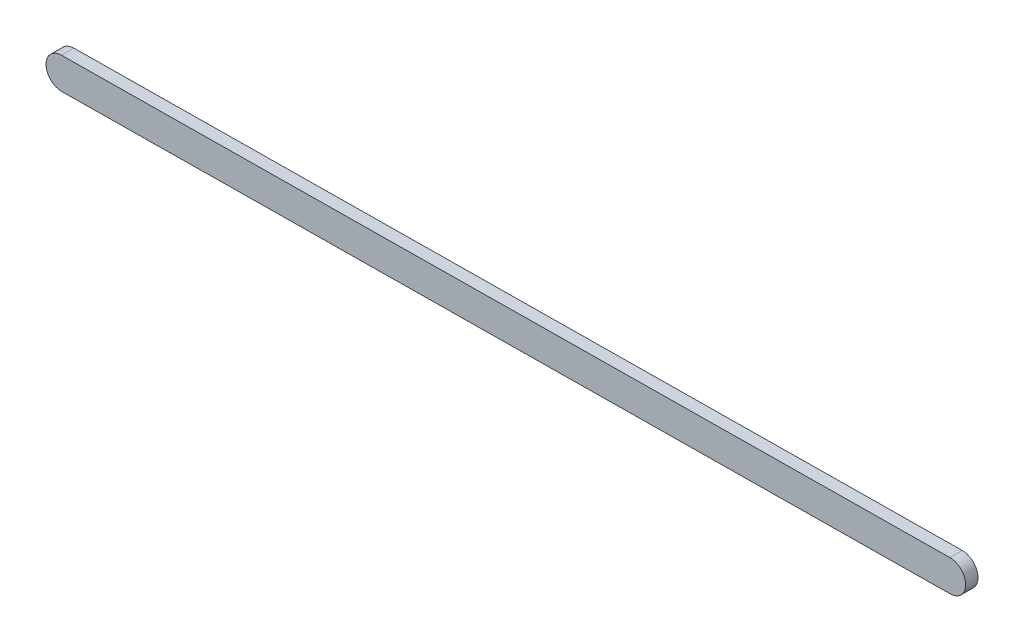
ISO-10303-21;
HEADER;
FILE_DESCRIPTION(('STEP AP214'),'2;1');
FILE_NAME('part.step','',(''),(''),'','','');
FILE_SCHEMA(('AUTOMOTIVE_DESIGN { 1 0 10303 214 1 1 1 1 }'));
ENDSEC;
DATA;
#1=APPLICATION_CONTEXT('core data for automotive mechanical design processes');
#2=APPLICATION_PROTOCOL_DEFINITION('international standard','automotive_design',2000,#1);
#3=PRODUCT_CONTEXT('',#1,'mechanical');
#4=PRODUCT('Part','Part','',(#3));
#5=PRODUCT_RELATED_PRODUCT_CATEGORY('part','',(#4));
#6=PRODUCT_DEFINITION_FORMATION('','',#4);
#7=PRODUCT_DEFINITION_CONTEXT('part definition',#1,'design');
#8=PRODUCT_DEFINITION('design','',#6,#7);
#9=PRODUCT_DEFINITION_SHAPE('','',#8);
#10=(LENGTH_UNIT() NAMED_UNIT(*) SI_UNIT(.MILLI.,.METRE.));
#11=(NAMED_UNIT(*) PLANE_ANGLE_UNIT() SI_UNIT($,.RADIAN.));
#12=(NAMED_UNIT(*) SI_UNIT($,.STERADIAN.) SOLID_ANGLE_UNIT());
#13=UNCERTAINTY_MEASURE_WITH_UNIT(LENGTH_MEASURE(1.E-05),#10,'distance_accuracy_value','');
#14=(GEOMETRIC_REPRESENTATION_CONTEXT(3) GLOBAL_UNCERTAINTY_ASSIGNED_CONTEXT((#13)) GLOBAL_UNIT_ASSIGNED_CONTEXT((#10,
#11,#12)) REPRESENTATION_CONTEXT('',''));
#15=CARTESIAN_POINT('',(0.,0.,0.));
#16=DIRECTION('',(0.,0.,1.));
#17=DIRECTION('',(1.,0.,0.));
#18=AXIS2_PLACEMENT_3D('',#15,#16,#17);
#19=CARTESIAN_POINT('',(94.83165438,53.00981524,0.));
#20=DIRECTION('',(-0.010322812390654,0.999946718352707,0.));
#21=DIRECTION('',(0.999946718352707,0.010322812390654,0.));
#22=AXIS2_PLACEMENT_3D('',#19,#20,#21);
#23=PLANE('',#22);
#24=DIRECTION('',(0.999946718352707,0.010322812390654,0.));
#25=VECTOR('',#24,1.);
#26=CARTESIAN_POINT('',(94.83165438,53.00981524,0.1999996));
#27=LINE('',#26,#25);
#28=CARTESIAN_POINT('',(94.83165438,53.00981524,0.1999996));
#29=VERTEX_POINT('',#28);
#30=CARTESIAN_POINT('',(109.24441194,53.15860336,0.1999996));
#31=VERTEX_POINT('',#30);
#32=EDGE_CURVE('E11',#29,#31,#27,.T.);
#33=ORIENTED_EDGE('',*,*,#32,.F.);
#34=DIRECTION('',(0.,0.,1.));
#35=VECTOR('',#34,1.);
#36=CARTESIAN_POINT('',(94.83165438,53.00981524,0.));
#37=LINE('',#36,#35);
#38=CARTESIAN_POINT('',(94.83165438,53.00981524,0.));
#39=VERTEX_POINT('',#38);
#40=EDGE_CURVE('E24',#39,#29,#37,.T.);
#41=ORIENTED_EDGE('',*,*,#40,.F.);
#42=DIRECTION('',(0.999946718352707,0.010322812390654,0.));
#43=VECTOR('',#42,1.);
#44=CARTESIAN_POINT('',(94.83165438,53.00981524,0.));
#45=LINE('',#44,#43);
#46=CARTESIAN_POINT('',(109.24441194,53.15860336,0.));
#47=VERTEX_POINT('',#46);
#48=EDGE_CURVE('E75',#39,#47,#45,.T.);
#49=ORIENTED_EDGE('',*,*,#48,.T.);
#50=DIRECTION('',(0.,0.,1.));
#51=VECTOR('',#50,1.);
#52=CARTESIAN_POINT('',(109.24441194,53.15860336,0.));
#53=LINE('',#52,#51);
#54=EDGE_CURVE('E37',#47,#31,#53,.T.);
#55=ORIENTED_EDGE('',*,*,#54,.T.);
#56=EDGE_LOOP('',(#33,#41,#49,#55));
#57=FACE_BOUND('',#56,.T.);
#58=ADVANCED_FACE('F17',(#57),#23,.F.);
#59=CARTESIAN_POINT('',(109.241788120258,53.4125906337885,0.));
#60=DIRECTION('',(0.,0.,-1.));
#61=DIRECTION('',(0.0103299653868157,-0.999946644484148,0.));
#62=AXIS2_PLACEMENT_3D('',#59,#60,#61);
#63=CYLINDRICAL_SURFACE('',#62,0.254000826133655);
#64=CARTESIAN_POINT('',(109.241788120258,53.4125906337885,0.1999996));
#65=DIRECTION('',(0.,0.,1.));
#66=DIRECTION('',(0.0103299653868157,-0.999946644484148,0.));
#67=AXIS2_PLACEMENT_3D('',#64,#65,#66);
#68=CIRCLE('',#67,0.254000826133655);
#69=CARTESIAN_POINT('',(109.23916938,53.66657796,0.1999996));
#70=VERTEX_POINT('',#69);
#71=EDGE_CURVE('E83',#31,#70,#68,.T.);
#72=ORIENTED_EDGE('',*,*,#71,.F.);
#73=ORIENTED_EDGE('',*,*,#54,.F.);
#74=CARTESIAN_POINT('',(109.241788120258,53.4125906337885,0.));
#75=DIRECTION('',(0.,0.,1.));
#76=DIRECTION('',(0.0103299653868157,-0.999946644484148,0.));
#77=AXIS2_PLACEMENT_3D('',#74,#75,#76);
#78=CIRCLE('',#77,0.254000826133655);
#79=CARTESIAN_POINT('',(109.23916938,53.66657796,0.));
#80=VERTEX_POINT('',#79);
#81=EDGE_CURVE('E81',#47,#80,#78,.T.);
#82=ORIENTED_EDGE('',*,*,#81,.T.);
#83=DIRECTION('',(0.,0.,1.));
#84=VECTOR('',#83,1.);
#85=CARTESIAN_POINT('',(109.23916938,53.66657796,0.));
#86=LINE('',#85,#84);
#87=EDGE_CURVE('E67',#80,#70,#86,.T.);
#88=ORIENTED_EDGE('',*,*,#87,.T.);
#89=EDGE_LOOP('',(#72,#73,#82,#88));
#90=FACE_BOUND('',#89,.T.);
#91=ADVANCED_FACE('F89',(#90),#63,.T.);
#92=CARTESIAN_POINT('',(109.23916938,53.66657796,0.));
#93=DIRECTION('',(0.010322812390655,-0.999946718352707,0.));
#94=DIRECTION('',(-0.999946718352707,-0.010322812390655,0.));
#95=AXIS2_PLACEMENT_3D('',#92,#93,#94);
#96=PLANE('',#95);
#97=DIRECTION('',(-0.999946718352707,-0.010322812390655,0.));
#98=VECTOR('',#97,1.);
#99=CARTESIAN_POINT('',(109.23916938,53.66657796,0.1999996));
#100=LINE('',#99,#98);
#101=CARTESIAN_POINT('',(94.82641182,53.51778984,0.1999996));
#102=VERTEX_POINT('',#101);
#103=EDGE_CURVE('E71',#70,#102,#100,.T.);
#104=ORIENTED_EDGE('',*,*,#103,.F.);
#105=ORIENTED_EDGE('',*,*,#87,.F.);
#106=DIRECTION('',(-0.999946718352707,-0.010322812390655,0.));
#107=VECTOR('',#106,1.);
#108=CARTESIAN_POINT('',(109.23916938,53.66657796,0.));
#109=LINE('',#108,#107);
#110=CARTESIAN_POINT('',(94.82641182,53.51778984,0.));
#111=VERTEX_POINT('',#110);
#112=EDGE_CURVE('E63',#80,#111,#109,.T.);
#113=ORIENTED_EDGE('',*,*,#112,.T.);
#114=DIRECTION('',(0.,0.,1.));
#115=VECTOR('',#114,1.);
#116=CARTESIAN_POINT('',(94.82641182,53.51778984,0.));
#117=LINE('',#116,#115);
#118=EDGE_CURVE('E53',#111,#102,#117,.T.);
#119=ORIENTED_EDGE('',*,*,#118,.T.);
#120=EDGE_LOOP('',(#104,#105,#113,#119));
#121=FACE_BOUND('',#120,.T.);
#122=ADVANCED_FACE('F66',(#121),#96,.F.);
#123=CARTESIAN_POINT('',(94.8290356397422,53.2638025662115,0.));
#124=DIRECTION('',(0.,0.,-1.));
#125=DIRECTION('',(-0.010329965386816,0.999946644484148,0.));
#126=AXIS2_PLACEMENT_3D('',#123,#124,#125);
#127=CYLINDRICAL_SURFACE('',#126,0.254000826133651);
#128=CARTESIAN_POINT('',(94.8290356397422,53.2638025662115,0.1999996));
#129=DIRECTION('',(0.,0.,1.));
#130=DIRECTION('',(-0.010329965386816,0.999946644484148,0.));
#131=AXIS2_PLACEMENT_3D('',#128,#129,#130);
#132=CIRCLE('',#131,0.254000826133651);
#133=EDGE_CURVE('E59',#102,#29,#132,.T.);
#134=ORIENTED_EDGE('',*,*,#133,.F.);
#135=ORIENTED_EDGE('',*,*,#118,.F.);
#136=CARTESIAN_POINT('',(94.8290356397422,53.2638025662115,0.));
#137=DIRECTION('',(0.,0.,1.));
#138=DIRECTION('',(-0.010329965386816,0.999946644484148,0.));
#139=AXIS2_PLACEMENT_3D('',#136,#137,#138);
#140=CIRCLE('',#139,0.254000826133651);
#141=EDGE_CURVE('E57',#111,#39,#140,.T.);
#142=ORIENTED_EDGE('',*,*,#141,.T.);
#143=ORIENTED_EDGE('',*,*,#40,.T.);
#144=EDGE_LOOP('',(#134,#135,#142,#143));
#145=FACE_BOUND('',#144,.T.);
#146=ADVANCED_FACE('F55',(#145),#127,.T.);
#147=CARTESIAN_POINT('',(94.83165438,53.00981524,0.));
#148=DIRECTION('',(0.,0.,-1.));
#149=DIRECTION('',(-1.,0.,0.));
#150=AXIS2_PLACEMENT_3D('',#147,#148,#149);
#151=PLANE('',#150);
#152=ORIENTED_EDGE('',*,*,#141,.F.);
#153=ORIENTED_EDGE('',*,*,#112,.F.);
#154=ORIENTED_EDGE('',*,*,#81,.F.);
#155=ORIENTED_EDGE('',*,*,#48,.F.);
#156=EDGE_LOOP('',(#152,#153,#154,#155));
#157=FACE_BOUND('',#156,.T.);
#158=ADVANCED_FACE('F74',(#157),#151,.T.);
#159=CARTESIAN_POINT('',(94.83165438,53.00981524,0.1999996));
#160=DIRECTION('',(0.,0.,-1.));
#161=DIRECTION('',(-1.,0.,0.));
#162=AXIS2_PLACEMENT_3D('',#159,#160,#161);
#163=PLANE('',#162);
#164=ORIENTED_EDGE('',*,*,#32,.T.);
#165=ORIENTED_EDGE('',*,*,#71,.T.);
#166=ORIENTED_EDGE('',*,*,#103,.T.);
#167=ORIENTED_EDGE('',*,*,#133,.T.);
#168=EDGE_LOOP('',(#164,#165,#166,#167));
#169=FACE_BOUND('',#168,.T.);
#170=ADVANCED_FACE('F91',(#169),#163,.F.);
#171=CLOSED_SHELL('',(#58,#91,#122,#146,#158,#170));
#172=MANIFOLD_SOLID_BREP('B1',#171);
#173=ADVANCED_BREP_SHAPE_REPRESENTATION('',(#18,#172),#14);
#174=SHAPE_DEFINITION_REPRESENTATION(#9,#173);
ENDSEC;
END-ISO-10303-21;
